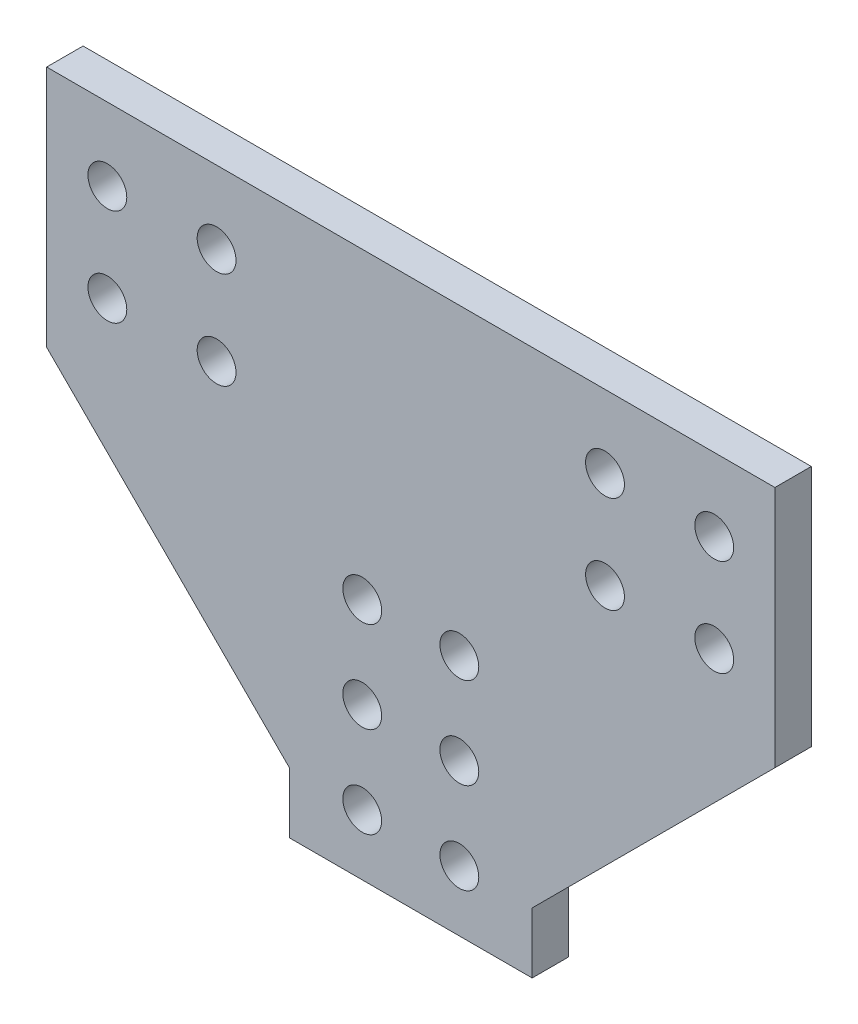
ISO-10303-21;
HEADER;
FILE_DESCRIPTION(('STEP AP214'),'2;1');
FILE_NAME('part.step','',(''),(''),'','','');
FILE_SCHEMA(('AUTOMOTIVE_DESIGN { 1 0 10303 214 1 1 1 1 }'));
ENDSEC;
DATA;
#1=APPLICATION_CONTEXT('core data for automotive mechanical design processes');
#2=APPLICATION_PROTOCOL_DEFINITION('international standard','automotive_design',2000,#1);
#3=PRODUCT_CONTEXT('',#1,'mechanical');
#4=PRODUCT('Part','Part','',(#3));
#5=PRODUCT_RELATED_PRODUCT_CATEGORY('part','',(#4));
#6=PRODUCT_DEFINITION_FORMATION('','',#4);
#7=PRODUCT_DEFINITION_CONTEXT('part definition',#1,'design');
#8=PRODUCT_DEFINITION('design','',#6,#7);
#9=PRODUCT_DEFINITION_SHAPE('','',#8);
#10=(LENGTH_UNIT() NAMED_UNIT(*) SI_UNIT(.MILLI.,.METRE.));
#11=(NAMED_UNIT(*) PLANE_ANGLE_UNIT() SI_UNIT($,.RADIAN.));
#12=(NAMED_UNIT(*) SI_UNIT($,.STERADIAN.) SOLID_ANGLE_UNIT());
#13=UNCERTAINTY_MEASURE_WITH_UNIT(LENGTH_MEASURE(1.E-05),#10,'distance_accuracy_value','');
#14=(GEOMETRIC_REPRESENTATION_CONTEXT(3) GLOBAL_UNCERTAINTY_ASSIGNED_CONTEXT((#13)) GLOBAL_UNIT_ASSIGNED_CONTEXT((#10,
#11,#12)) REPRESENTATION_CONTEXT('',''));
#15=CARTESIAN_POINT('',(0.,0.,0.));
#16=DIRECTION('',(0.,0.,1.));
#17=DIRECTION('',(1.,0.,0.));
#18=AXIS2_PLACEMENT_3D('',#15,#16,#17);
#19=CARTESIAN_POINT('',(0.,0.,3.));
#20=DIRECTION('',(0.707106781186544,0.707106781186551,0.));
#21=DIRECTION('',(-0.707106781186551,0.707106781186544,0.));
#22=AXIS2_PLACEMENT_3D('',#19,#20,#21);
#23=PLANE('',#22);
#24=DIRECTION('',(0.707106781186552,-0.707106781186544,0.));
#25=VECTOR('',#24,1.);
#26=CARTESIAN_POINT('',(0.,0.,0.));
#27=LINE('',#26,#25);
#28=CARTESIAN_POINT('',(0.,0.,0.));
#29=VERTEX_POINT('',#28);
#30=CARTESIAN_POINT('',(20.,-19.9999999999998,0.));
#31=VERTEX_POINT('',#30);
#32=EDGE_CURVE('E131',#29,#31,#27,.T.);
#33=ORIENTED_EDGE('',*,*,#32,.T.);
#34=DIRECTION('',(0.,0.,-1.));
#35=VECTOR('',#34,1.);
#36=CARTESIAN_POINT('',(20.,-19.9999999999998,3.));
#37=LINE('',#36,#35);
#38=CARTESIAN_POINT('',(20.,-19.9999999999998,3.));
#39=VERTEX_POINT('',#38);
#40=EDGE_CURVE('E11',#39,#31,#37,.T.);
#41=ORIENTED_EDGE('',*,*,#40,.F.);
#42=DIRECTION('',(0.707106781186552,-0.707106781186544,0.));
#43=VECTOR('',#42,1.);
#44=CARTESIAN_POINT('',(0.,0.,3.));
#45=LINE('',#44,#43);
#46=CARTESIAN_POINT('',(0.,0.,3.));
#47=VERTEX_POINT('',#46);
#48=EDGE_CURVE('E146',#47,#39,#45,.T.);
#49=ORIENTED_EDGE('',*,*,#48,.F.);
#50=DIRECTION('',(0.,0.,-1.));
#51=VECTOR('',#50,1.);
#52=CARTESIAN_POINT('',(0.,0.,3.));
#53=LINE('',#52,#51);
#54=EDGE_CURVE('E127',#47,#29,#53,.T.);
#55=ORIENTED_EDGE('',*,*,#54,.T.);
#56=EDGE_LOOP('',(#33,#41,#49,#55));
#57=FACE_BOUND('',#56,.T.);
#58=ADVANCED_FACE('F35',(#57),#23,.F.);
#59=CARTESIAN_POINT('',(20.,-19.9999999999998,3.));
#60=DIRECTION('',(1.,0.,0.));
#61=DIRECTION('',(0.,0.,-1.));
#62=AXIS2_PLACEMENT_3D('',#59,#60,#61);
#63=PLANE('',#62);
#64=DIRECTION('',(0.,-1.,0.));
#65=VECTOR('',#64,1.);
#66=CARTESIAN_POINT('',(20.,-19.9999999999998,0.));
#67=LINE('',#66,#65);
#68=CARTESIAN_POINT('',(20.,-25.,0.));
#69=VERTEX_POINT('',#68);
#70=EDGE_CURVE('E134',#31,#69,#67,.T.);
#71=ORIENTED_EDGE('',*,*,#70,.T.);
#72=DIRECTION('',(0.,0.,-1.));
#73=VECTOR('',#72,1.);
#74=CARTESIAN_POINT('',(20.,-25.,3.));
#75=LINE('',#74,#73);
#76=CARTESIAN_POINT('',(20.,-25.,3.));
#77=VERTEX_POINT('',#76);
#78=EDGE_CURVE('E43',#77,#69,#75,.T.);
#79=ORIENTED_EDGE('',*,*,#78,.F.);
#80=DIRECTION('',(0.,-1.,0.));
#81=VECTOR('',#80,1.);
#82=CARTESIAN_POINT('',(20.,-19.9999999999998,3.));
#83=LINE('',#82,#81);
#84=EDGE_CURVE('E94',#39,#77,#83,.T.);
#85=ORIENTED_EDGE('',*,*,#84,.F.);
#86=ORIENTED_EDGE('',*,*,#40,.T.);
#87=EDGE_LOOP('',(#71,#79,#85,#86));
#88=FACE_BOUND('',#87,.T.);
#89=ADVANCED_FACE('F305',(#88),#63,.F.);
#90=CARTESIAN_POINT('',(40.,-25.,3.));
#91=DIRECTION('',(0.,1.,0.));
#92=DIRECTION('',(0.,0.,1.));
#93=AXIS2_PLACEMENT_3D('',#90,#91,#92);
#94=PLANE('',#93);
#95=DIRECTION('',(1.,0.,0.));
#96=VECTOR('',#95,1.);
#97=CARTESIAN_POINT('',(40.,-25.,0.));
#98=LINE('',#97,#96);
#99=CARTESIAN_POINT('',(40.,-25.,0.));
#100=VERTEX_POINT('',#99);
#101=EDGE_CURVE('E137',#69,#100,#98,.T.);
#102=ORIENTED_EDGE('',*,*,#101,.T.);
#103=DIRECTION('',(0.,0.,-1.));
#104=VECTOR('',#103,1.);
#105=CARTESIAN_POINT('',(40.,-25.,3.));
#106=LINE('',#105,#104);
#107=CARTESIAN_POINT('',(40.,-25.,3.));
#108=VERTEX_POINT('',#107);
#109=EDGE_CURVE('E153',#108,#100,#106,.T.);
#110=ORIENTED_EDGE('',*,*,#109,.F.);
#111=DIRECTION('',(1.,0.,0.));
#112=VECTOR('',#111,1.);
#113=CARTESIAN_POINT('',(40.,-25.,3.));
#114=LINE('',#113,#112);
#115=EDGE_CURVE('E161',#77,#108,#114,.T.);
#116=ORIENTED_EDGE('',*,*,#115,.F.);
#117=ORIENTED_EDGE('',*,*,#78,.T.);
#118=EDGE_LOOP('',(#102,#110,#116,#117));
#119=FACE_BOUND('',#118,.T.);
#120=ADVANCED_FACE('F159',(#119),#94,.F.);
#121=CARTESIAN_POINT('',(40.,-20.0000000000001,3.));
#122=DIRECTION('',(-1.,0.,0.));
#123=DIRECTION('',(0.,0.,1.));
#124=AXIS2_PLACEMENT_3D('',#121,#122,#123);
#125=PLANE('',#124);
#126=DIRECTION('',(0.,1.,0.));
#127=VECTOR('',#126,1.);
#128=CARTESIAN_POINT('',(40.,-20.0000000000001,0.));
#129=LINE('',#128,#127);
#130=CARTESIAN_POINT('',(40.,-20.0000000000001,0.));
#131=VERTEX_POINT('',#130);
#132=EDGE_CURVE('E139',#100,#131,#129,.T.);
#133=ORIENTED_EDGE('',*,*,#132,.T.);
#134=DIRECTION('',(0.,0.,-1.));
#135=VECTOR('',#134,1.);
#136=CARTESIAN_POINT('',(40.,-20.0000000000001,3.));
#137=LINE('',#136,#135);
#138=CARTESIAN_POINT('',(40.,-20.0000000000001,3.));
#139=VERTEX_POINT('',#138);
#140=EDGE_CURVE('E150',#139,#131,#137,.T.);
#141=ORIENTED_EDGE('',*,*,#140,.F.);
#142=DIRECTION('',(0.,1.,0.));
#143=VECTOR('',#142,1.);
#144=CARTESIAN_POINT('',(40.,-20.0000000000001,3.));
#145=LINE('',#144,#143);
#146=EDGE_CURVE('E173',#108,#139,#145,.T.);
#147=ORIENTED_EDGE('',*,*,#146,.F.);
#148=ORIENTED_EDGE('',*,*,#109,.T.);
#149=EDGE_LOOP('',(#133,#141,#147,#148));
#150=FACE_BOUND('',#149,.T.);
#151=ADVANCED_FACE('F169',(#150),#125,.F.);
#152=CARTESIAN_POINT('',(60.,0.,3.));
#153=DIRECTION('',(-0.707106781186549,0.707106781186546,0.));
#154=DIRECTION('',(-0.707106781186546,-0.707106781186549,0.));
#155=AXIS2_PLACEMENT_3D('',#152,#153,#154);
#156=PLANE('',#155);
#157=DIRECTION('',(0.707106781186546,0.707106781186549,0.));
#158=VECTOR('',#157,1.);
#159=CARTESIAN_POINT('',(60.,0.,0.));
#160=LINE('',#159,#158);
#161=CARTESIAN_POINT('',(60.,0.,0.));
#162=VERTEX_POINT('',#161);
#163=EDGE_CURVE('E141',#131,#162,#160,.T.);
#164=ORIENTED_EDGE('',*,*,#163,.T.);
#165=DIRECTION('',(0.,0.,-1.));
#166=VECTOR('',#165,1.);
#167=CARTESIAN_POINT('',(60.,0.,3.));
#168=LINE('',#167,#166);
#169=CARTESIAN_POINT('',(60.,0.,3.));
#170=VERTEX_POINT('',#169);
#171=EDGE_CURVE('E122',#170,#162,#168,.T.);
#172=ORIENTED_EDGE('',*,*,#171,.F.);
#173=DIRECTION('',(0.707106781186546,0.707106781186549,0.));
#174=VECTOR('',#173,1.);
#175=CARTESIAN_POINT('',(60.,0.,3.));
#176=LINE('',#175,#174);
#177=EDGE_CURVE('E113',#139,#170,#176,.T.);
#178=ORIENTED_EDGE('',*,*,#177,.F.);
#179=ORIENTED_EDGE('',*,*,#140,.T.);
#180=EDGE_LOOP('',(#164,#172,#178,#179));
#181=FACE_BOUND('',#180,.T.);
#182=ADVANCED_FACE('F172',(#181),#156,.F.);
#183=CARTESIAN_POINT('',(60.,20.,3.));
#184=DIRECTION('',(-1.,0.,0.));
#185=DIRECTION('',(0.,0.,1.));
#186=AXIS2_PLACEMENT_3D('',#183,#184,#185);
#187=PLANE('',#186);
#188=DIRECTION('',(0.,1.,0.));
#189=VECTOR('',#188,1.);
#190=CARTESIAN_POINT('',(60.,20.,0.));
#191=LINE('',#190,#189);
#192=CARTESIAN_POINT('',(60.,20.,0.));
#193=VERTEX_POINT('',#192);
#194=EDGE_CURVE('E121',#162,#193,#191,.T.);
#195=ORIENTED_EDGE('',*,*,#194,.T.);
#196=DIRECTION('',(0.,0.,-1.));
#197=VECTOR('',#196,1.);
#198=CARTESIAN_POINT('',(60.,20.,3.));
#199=LINE('',#198,#197);
#200=CARTESIAN_POINT('',(60.,20.,3.));
#201=VERTEX_POINT('',#200);
#202=EDGE_CURVE('E118',#201,#193,#199,.T.);
#203=ORIENTED_EDGE('',*,*,#202,.F.);
#204=DIRECTION('',(0.,1.,0.));
#205=VECTOR('',#204,1.);
#206=CARTESIAN_POINT('',(60.,20.,3.));
#207=LINE('',#206,#205);
#208=EDGE_CURVE('E107',#170,#201,#207,.T.);
#209=ORIENTED_EDGE('',*,*,#208,.F.);
#210=ORIENTED_EDGE('',*,*,#171,.T.);
#211=EDGE_LOOP('',(#195,#203,#209,#210));
#212=FACE_BOUND('',#211,.T.);
#213=ADVANCED_FACE('F119',(#212),#187,.F.);
#214=CARTESIAN_POINT('',(0.,20.,3.));
#215=DIRECTION('',(0.,-1.,0.));
#216=DIRECTION('',(0.,0.,-1.));
#217=AXIS2_PLACEMENT_3D('',#214,#215,#216);
#218=PLANE('',#217);
#219=DIRECTION('',(-1.,0.,0.));
#220=VECTOR('',#219,1.);
#221=CARTESIAN_POINT('',(0.,20.,0.));
#222=LINE('',#221,#220);
#223=CARTESIAN_POINT('',(0.,20.,0.));
#224=VERTEX_POINT('',#223);
#225=EDGE_CURVE('E80',#193,#224,#222,.T.);
#226=ORIENTED_EDGE('',*,*,#225,.T.);
#227=DIRECTION('',(0.,0.,-1.));
#228=VECTOR('',#227,1.);
#229=CARTESIAN_POINT('',(0.,20.,3.));
#230=LINE('',#229,#228);
#231=CARTESIAN_POINT('',(0.,20.,3.));
#232=VERTEX_POINT('',#231);
#233=EDGE_CURVE('E123',#232,#224,#230,.T.);
#234=ORIENTED_EDGE('',*,*,#233,.F.);
#235=DIRECTION('',(-1.,0.,0.));
#236=VECTOR('',#235,1.);
#237=CARTESIAN_POINT('',(0.,20.,3.));
#238=LINE('',#237,#236);
#239=EDGE_CURVE('E111',#201,#232,#238,.T.);
#240=ORIENTED_EDGE('',*,*,#239,.F.);
#241=ORIENTED_EDGE('',*,*,#202,.T.);
#242=EDGE_LOOP('',(#226,#234,#240,#241));
#243=FACE_BOUND('',#242,.T.);
#244=ADVANCED_FACE('F125',(#243),#218,.F.);
#245=CARTESIAN_POINT('',(0.,0.,3.));
#246=DIRECTION('',(1.,0.,0.));
#247=DIRECTION('',(0.,0.,-1.));
#248=AXIS2_PLACEMENT_3D('',#245,#246,#247);
#249=PLANE('',#248);
#250=DIRECTION('',(0.,-1.,0.));
#251=VECTOR('',#250,1.);
#252=CARTESIAN_POINT('',(0.,0.,0.));
#253=LINE('',#252,#251);
#254=EDGE_CURVE('E86',#224,#29,#253,.T.);
#255=ORIENTED_EDGE('',*,*,#254,.T.);
#256=ORIENTED_EDGE('',*,*,#54,.F.);
#257=DIRECTION('',(0.,-1.,0.));
#258=VECTOR('',#257,1.);
#259=CARTESIAN_POINT('',(0.,0.,3.));
#260=LINE('',#259,#258);
#261=EDGE_CURVE('E51',#232,#47,#260,.T.);
#262=ORIENTED_EDGE('',*,*,#261,.F.);
#263=ORIENTED_EDGE('',*,*,#233,.T.);
#264=EDGE_LOOP('',(#255,#256,#262,#263));
#265=FACE_BOUND('',#264,.T.);
#266=ADVANCED_FACE('F275',(#265),#249,.F.);
#267=CARTESIAN_POINT('',(0.,0.,3.));
#268=DIRECTION('',(0.,0.,-1.));
#269=DIRECTION('',(-1.,0.,0.));
#270=AXIS2_PLACEMENT_3D('',#267,#268,#269);
#271=PLANE('',#270);
#272=CARTESIAN_POINT('',(34.,-12.5,3.));
#273=DIRECTION('',(0.,0.,1.));
#274=DIRECTION('',(1.,0.,0.));
#275=AXIS2_PLACEMENT_3D('',#272,#273,#274);
#276=CIRCLE('',#275,1.6);
#277=CARTESIAN_POINT('',(35.6,-12.5,3.));
#278=VERTEX_POINT('',#277);
#279=EDGE_CURVE('E216',#278,#278,#276,.T.);
#280=ORIENTED_EDGE('',*,*,#279,.F.);
#281=EDGE_LOOP('',(#280));
#282=FACE_BOUND('',#281,.T.);
#283=CARTESIAN_POINT('',(5.,14.,3.));
#284=DIRECTION('',(0.,0.,1.));
#285=DIRECTION('',(1.,0.,0.));
#286=AXIS2_PLACEMENT_3D('',#283,#284,#285);
#287=CIRCLE('',#286,1.6);
#288=CARTESIAN_POINT('',(6.6,14.,3.));
#289=VERTEX_POINT('',#288);
#290=EDGE_CURVE('E209',#289,#289,#287,.T.);
#291=ORIENTED_EDGE('',*,*,#290,.F.);
#292=EDGE_LOOP('',(#291));
#293=FACE_BOUND('',#292,.T.);
#294=CARTESIAN_POINT('',(5.,6.,3.));
#295=DIRECTION('',(0.,0.,1.));
#296=DIRECTION('',(1.,0.,0.));
#297=AXIS2_PLACEMENT_3D('',#294,#295,#296);
#298=CIRCLE('',#297,1.6);
#299=CARTESIAN_POINT('',(6.6,6.,3.));
#300=VERTEX_POINT('',#299);
#301=EDGE_CURVE('E228',#300,#300,#298,.T.);
#302=ORIENTED_EDGE('',*,*,#301,.F.);
#303=EDGE_LOOP('',(#302));
#304=FACE_BOUND('',#303,.T.);
#305=CARTESIAN_POINT('',(14.,14.,3.));
#306=DIRECTION('',(0.,0.,1.));
#307=DIRECTION('',(1.,0.,0.));
#308=AXIS2_PLACEMENT_3D('',#305,#306,#307);
#309=CIRCLE('',#308,1.6);
#310=CARTESIAN_POINT('',(15.6,14.,3.));
#311=VERTEX_POINT('',#310);
#312=EDGE_CURVE('E221',#311,#311,#309,.T.);
#313=ORIENTED_EDGE('',*,*,#312,.F.);
#314=EDGE_LOOP('',(#313));
#315=FACE_BOUND('',#314,.T.);
#316=CARTESIAN_POINT('',(34.,-5.,3.));
#317=DIRECTION('',(0.,0.,1.));
#318=DIRECTION('',(1.,0.,0.));
#319=AXIS2_PLACEMENT_3D('',#316,#317,#318);
#320=CIRCLE('',#319,1.6);
#321=CARTESIAN_POINT('',(35.6,-5.,3.));
#322=VERTEX_POINT('',#321);
#323=EDGE_CURVE('E192',#322,#322,#320,.T.);
#324=ORIENTED_EDGE('',*,*,#323,.F.);
#325=EDGE_LOOP('',(#324));
#326=FACE_BOUND('',#325,.T.);
#327=CARTESIAN_POINT('',(26.,-20.,3.));
#328=DIRECTION('',(0.,0.,1.));
#329=DIRECTION('',(1.,0.,0.));
#330=AXIS2_PLACEMENT_3D('',#327,#328,#329);
#331=CIRCLE('',#330,1.6);
#332=CARTESIAN_POINT('',(27.6,-20.,3.));
#333=VERTEX_POINT('',#332);
#334=EDGE_CURVE('E185',#333,#333,#331,.T.);
#335=ORIENTED_EDGE('',*,*,#334,.F.);
#336=EDGE_LOOP('',(#335));
#337=FACE_BOUND('',#336,.T.);
#338=CARTESIAN_POINT('',(34.,-20.,3.));
#339=DIRECTION('',(0.,0.,1.));
#340=DIRECTION('',(1.,0.,0.));
#341=AXIS2_PLACEMENT_3D('',#338,#339,#340);
#342=CIRCLE('',#341,1.6);
#343=CARTESIAN_POINT('',(35.6,-20.,3.));
#344=VERTEX_POINT('',#343);
#345=EDGE_CURVE('E204',#344,#344,#342,.T.);
#346=ORIENTED_EDGE('',*,*,#345,.F.);
#347=EDGE_LOOP('',(#346));
#348=FACE_BOUND('',#347,.T.);
#349=CARTESIAN_POINT('',(26.,-12.5,3.));
#350=DIRECTION('',(0.,0.,1.));
#351=DIRECTION('',(1.,0.,0.));
#352=AXIS2_PLACEMENT_3D('',#349,#350,#351);
#353=CIRCLE('',#352,1.6);
#354=CARTESIAN_POINT('',(27.6,-12.5,3.));
#355=VERTEX_POINT('',#354);
#356=EDGE_CURVE('E197',#355,#355,#353,.T.);
#357=ORIENTED_EDGE('',*,*,#356,.F.);
#358=EDGE_LOOP('',(#357));
#359=FACE_BOUND('',#358,.T.);
#360=CARTESIAN_POINT('',(46.,6.,3.));
#361=DIRECTION('',(0.,0.,1.));
#362=DIRECTION('',(1.,0.,0.));
#363=AXIS2_PLACEMENT_3D('',#360,#361,#362);
#364=CIRCLE('',#363,1.6);
#365=CARTESIAN_POINT('',(47.6,6.,3.));
#366=VERTEX_POINT('',#365);
#367=EDGE_CURVE('E257',#366,#366,#364,.T.);
#368=ORIENTED_EDGE('',*,*,#367,.F.);
#369=EDGE_LOOP('',(#368));
#370=FACE_BOUND('',#369,.T.);
#371=CARTESIAN_POINT('',(14.,6.,3.));
#372=DIRECTION('',(0.,0.,1.));
#373=DIRECTION('',(1.,0.,0.));
#374=AXIS2_PLACEMENT_3D('',#371,#372,#373);
#375=CIRCLE('',#374,1.6);
#376=CARTESIAN_POINT('',(15.6,6.,3.));
#377=VERTEX_POINT('',#376);
#378=EDGE_CURVE('E240',#377,#377,#375,.T.);
#379=ORIENTED_EDGE('',*,*,#378,.F.);
#380=EDGE_LOOP('',(#379));
#381=FACE_BOUND('',#380,.T.);
#382=CARTESIAN_POINT('',(55.,14.,3.));
#383=DIRECTION('',(0.,0.,1.));
#384=DIRECTION('',(1.,0.,0.));
#385=AXIS2_PLACEMENT_3D('',#382,#383,#384);
#386=CIRCLE('',#385,1.6);
#387=CARTESIAN_POINT('',(56.6,14.,3.));
#388=VERTEX_POINT('',#387);
#389=EDGE_CURVE('E233',#388,#388,#386,.T.);
#390=ORIENTED_EDGE('',*,*,#389,.F.);
#391=EDGE_LOOP('',(#390));
#392=FACE_BOUND('',#391,.T.);
#393=CARTESIAN_POINT('',(55.,6.,3.));
#394=DIRECTION('',(0.,0.,1.));
#395=DIRECTION('',(1.,0.,0.));
#396=AXIS2_PLACEMENT_3D('',#393,#394,#395);
#397=CIRCLE('',#396,1.6);
#398=CARTESIAN_POINT('',(56.6,6.,3.));
#399=VERTEX_POINT('',#398);
#400=EDGE_CURVE('E252',#399,#399,#397,.T.);
#401=ORIENTED_EDGE('',*,*,#400,.F.);
#402=EDGE_LOOP('',(#401));
#403=FACE_BOUND('',#402,.T.);
#404=CARTESIAN_POINT('',(46.,14.,3.));
#405=DIRECTION('',(0.,0.,1.));
#406=DIRECTION('',(1.,0.,0.));
#407=AXIS2_PLACEMENT_3D('',#404,#405,#406);
#408=CIRCLE('',#407,1.6);
#409=CARTESIAN_POINT('',(47.6,14.,3.));
#410=VERTEX_POINT('',#409);
#411=EDGE_CURVE('E245',#410,#410,#408,.T.);
#412=ORIENTED_EDGE('',*,*,#411,.F.);
#413=EDGE_LOOP('',(#412));
#414=FACE_BOUND('',#413,.T.);
#415=CARTESIAN_POINT('',(26.,-5.,3.));
#416=DIRECTION('',(0.,0.,1.));
#417=DIRECTION('',(1.,0.,0.));
#418=AXIS2_PLACEMENT_3D('',#415,#416,#417);
#419=CIRCLE('',#418,1.6);
#420=CARTESIAN_POINT('',(27.6,-5.,3.));
#421=VERTEX_POINT('',#420);
#422=EDGE_CURVE('E179',#421,#421,#419,.T.);
#423=ORIENTED_EDGE('',*,*,#422,.F.);
#424=EDGE_LOOP('',(#423));
#425=FACE_BOUND('',#424,.T.);
#426=ORIENTED_EDGE('',*,*,#48,.T.);
#427=ORIENTED_EDGE('',*,*,#84,.T.);
#428=ORIENTED_EDGE('',*,*,#115,.T.);
#429=ORIENTED_EDGE('',*,*,#146,.T.);
#430=ORIENTED_EDGE('',*,*,#177,.T.);
#431=ORIENTED_EDGE('',*,*,#208,.T.);
#432=ORIENTED_EDGE('',*,*,#239,.T.);
#433=ORIENTED_EDGE('',*,*,#261,.T.);
#434=EDGE_LOOP('',(#426,#427,#428,#429,#430,#431,#432,#433));
#435=FACE_BOUND('',#434,.T.);
#436=ADVANCED_FACE('F109',(#282,#293,#304,#315,#326,#337,#348,#359,#370,#381,#392,#403,#414,
#425,#435),#271,.F.);
#437=CARTESIAN_POINT('',(0.,0.,0.));
#438=DIRECTION('',(0.,0.,-1.));
#439=DIRECTION('',(-1.,0.,0.));
#440=AXIS2_PLACEMENT_3D('',#437,#438,#439);
#441=PLANE('',#440);
#442=CARTESIAN_POINT('',(34.,-12.5,0.));
#443=DIRECTION('',(0.,0.,1.));
#444=DIRECTION('',(1.,0.,0.));
#445=AXIS2_PLACEMENT_3D('',#442,#443,#444);
#446=CIRCLE('',#445,1.6);
#447=CARTESIAN_POINT('',(35.6,-12.5,0.));
#448=VERTEX_POINT('',#447);
#449=EDGE_CURVE('E201',#448,#448,#446,.T.);
#450=ORIENTED_EDGE('',*,*,#449,.T.);
#451=EDGE_LOOP('',(#450));
#452=FACE_BOUND('',#451,.T.);
#453=CARTESIAN_POINT('',(5.,14.,0.));
#454=DIRECTION('',(0.,0.,1.));
#455=DIRECTION('',(1.,0.,0.));
#456=AXIS2_PLACEMENT_3D('',#453,#454,#455);
#457=CIRCLE('',#456,1.6);
#458=CARTESIAN_POINT('',(6.6,14.,0.));
#459=VERTEX_POINT('',#458);
#460=EDGE_CURVE('E212',#459,#459,#457,.T.);
#461=ORIENTED_EDGE('',*,*,#460,.T.);
#462=EDGE_LOOP('',(#461));
#463=FACE_BOUND('',#462,.T.);
#464=CARTESIAN_POINT('',(5.,6.,0.));
#465=DIRECTION('',(0.,0.,1.));
#466=DIRECTION('',(1.,0.,0.));
#467=AXIS2_PLACEMENT_3D('',#464,#465,#466);
#468=CIRCLE('',#467,1.6);
#469=CARTESIAN_POINT('',(6.6,6.,0.));
#470=VERTEX_POINT('',#469);
#471=EDGE_CURVE('E213',#470,#470,#468,.T.);
#472=ORIENTED_EDGE('',*,*,#471,.T.);
#473=EDGE_LOOP('',(#472));
#474=FACE_BOUND('',#473,.T.);
#475=CARTESIAN_POINT('',(14.,14.,0.));
#476=DIRECTION('',(0.,0.,1.));
#477=DIRECTION('',(1.,0.,0.));
#478=AXIS2_PLACEMENT_3D('',#475,#476,#477);
#479=CIRCLE('',#478,1.6);
#480=CARTESIAN_POINT('',(15.6,14.,0.));
#481=VERTEX_POINT('',#480);
#482=EDGE_CURVE('E224',#481,#481,#479,.T.);
#483=ORIENTED_EDGE('',*,*,#482,.T.);
#484=EDGE_LOOP('',(#483));
#485=FACE_BOUND('',#484,.T.);
#486=CARTESIAN_POINT('',(34.,-5.,0.));
#487=DIRECTION('',(0.,0.,1.));
#488=DIRECTION('',(1.,0.,0.));
#489=AXIS2_PLACEMENT_3D('',#486,#487,#488);
#490=CIRCLE('',#489,1.6);
#491=CARTESIAN_POINT('',(35.6,-5.,0.));
#492=VERTEX_POINT('',#491);
#493=EDGE_CURVE('E182',#492,#492,#490,.T.);
#494=ORIENTED_EDGE('',*,*,#493,.T.);
#495=EDGE_LOOP('',(#494));
#496=FACE_BOUND('',#495,.T.);
#497=CARTESIAN_POINT('',(26.,-20.,0.));
#498=DIRECTION('',(0.,0.,1.));
#499=DIRECTION('',(1.,0.,0.));
#500=AXIS2_PLACEMENT_3D('',#497,#498,#499);
#501=CIRCLE('',#500,1.6);
#502=CARTESIAN_POINT('',(27.6,-20.,0.));
#503=VERTEX_POINT('',#502);
#504=EDGE_CURVE('E188',#503,#503,#501,.T.);
#505=ORIENTED_EDGE('',*,*,#504,.T.);
#506=EDGE_LOOP('',(#505));
#507=FACE_BOUND('',#506,.T.);
#508=CARTESIAN_POINT('',(34.,-20.,0.));
#509=DIRECTION('',(0.,0.,1.));
#510=DIRECTION('',(1.,0.,0.));
#511=AXIS2_PLACEMENT_3D('',#508,#509,#510);
#512=CIRCLE('',#511,1.6);
#513=CARTESIAN_POINT('',(35.6,-20.,0.));
#514=VERTEX_POINT('',#513);
#515=EDGE_CURVE('E189',#514,#514,#512,.T.);
#516=ORIENTED_EDGE('',*,*,#515,.T.);
#517=EDGE_LOOP('',(#516));
#518=FACE_BOUND('',#517,.T.);
#519=CARTESIAN_POINT('',(26.,-12.5,0.));
#520=DIRECTION('',(0.,0.,1.));
#521=DIRECTION('',(1.,0.,0.));
#522=AXIS2_PLACEMENT_3D('',#519,#520,#521);
#523=CIRCLE('',#522,1.6);
#524=CARTESIAN_POINT('',(27.6,-12.5,0.));
#525=VERTEX_POINT('',#524);
#526=EDGE_CURVE('E200',#525,#525,#523,.T.);
#527=ORIENTED_EDGE('',*,*,#526,.T.);
#528=EDGE_LOOP('',(#527));
#529=FACE_BOUND('',#528,.T.);
#530=CARTESIAN_POINT('',(46.,6.,0.));
#531=DIRECTION('',(0.,0.,1.));
#532=DIRECTION('',(1.,0.,0.));
#533=AXIS2_PLACEMENT_3D('',#530,#531,#532);
#534=CIRCLE('',#533,1.6);
#535=CARTESIAN_POINT('',(47.6,6.,0.));
#536=VERTEX_POINT('',#535);
#537=EDGE_CURVE('E249',#536,#536,#534,.T.);
#538=ORIENTED_EDGE('',*,*,#537,.T.);
#539=EDGE_LOOP('',(#538));
#540=FACE_BOUND('',#539,.T.);
#541=CARTESIAN_POINT('',(14.,6.,0.));
#542=DIRECTION('',(0.,0.,1.));
#543=DIRECTION('',(1.,0.,0.));
#544=AXIS2_PLACEMENT_3D('',#541,#542,#543);
#545=CIRCLE('',#544,1.6);
#546=CARTESIAN_POINT('',(15.6,6.,0.));
#547=VERTEX_POINT('',#546);
#548=EDGE_CURVE('E225',#547,#547,#545,.T.);
#549=ORIENTED_EDGE('',*,*,#548,.T.);
#550=EDGE_LOOP('',(#549));
#551=FACE_BOUND('',#550,.T.);
#552=CARTESIAN_POINT('',(55.,14.,0.));
#553=DIRECTION('',(0.,0.,1.));
#554=DIRECTION('',(1.,0.,0.));
#555=AXIS2_PLACEMENT_3D('',#552,#553,#554);
#556=CIRCLE('',#555,1.6);
#557=CARTESIAN_POINT('',(56.6,14.,0.));
#558=VERTEX_POINT('',#557);
#559=EDGE_CURVE('E236',#558,#558,#556,.T.);
#560=ORIENTED_EDGE('',*,*,#559,.T.);
#561=EDGE_LOOP('',(#560));
#562=FACE_BOUND('',#561,.T.);
#563=CARTESIAN_POINT('',(55.,6.,0.));
#564=DIRECTION('',(0.,0.,1.));
#565=DIRECTION('',(1.,0.,0.));
#566=AXIS2_PLACEMENT_3D('',#563,#564,#565);
#567=CIRCLE('',#566,1.6);
#568=CARTESIAN_POINT('',(56.6,6.,0.));
#569=VERTEX_POINT('',#568);
#570=EDGE_CURVE('E237',#569,#569,#567,.T.);
#571=ORIENTED_EDGE('',*,*,#570,.T.);
#572=EDGE_LOOP('',(#571));
#573=FACE_BOUND('',#572,.T.);
#574=CARTESIAN_POINT('',(46.,14.,0.));
#575=DIRECTION('',(0.,0.,1.));
#576=DIRECTION('',(1.,0.,0.));
#577=AXIS2_PLACEMENT_3D('',#574,#575,#576);
#578=CIRCLE('',#577,1.6);
#579=CARTESIAN_POINT('',(47.6,14.,0.));
#580=VERTEX_POINT('',#579);
#581=EDGE_CURVE('E248',#580,#580,#578,.T.);
#582=ORIENTED_EDGE('',*,*,#581,.T.);
#583=EDGE_LOOP('',(#582));
#584=FACE_BOUND('',#583,.T.);
#585=CARTESIAN_POINT('',(26.,-5.,0.));
#586=DIRECTION('',(0.,0.,1.));
#587=DIRECTION('',(1.,0.,0.));
#588=AXIS2_PLACEMENT_3D('',#585,#586,#587);
#589=CIRCLE('',#588,1.6);
#590=CARTESIAN_POINT('',(27.6,-5.,0.));
#591=VERTEX_POINT('',#590);
#592=EDGE_CURVE('E135',#591,#591,#589,.T.);
#593=ORIENTED_EDGE('',*,*,#592,.T.);
#594=EDGE_LOOP('',(#593));
#595=FACE_BOUND('',#594,.T.);
#596=ORIENTED_EDGE('',*,*,#32,.F.);
#597=ORIENTED_EDGE('',*,*,#254,.F.);
#598=ORIENTED_EDGE('',*,*,#225,.F.);
#599=ORIENTED_EDGE('',*,*,#194,.F.);
#600=ORIENTED_EDGE('',*,*,#163,.F.);
#601=ORIENTED_EDGE('',*,*,#132,.F.);
#602=ORIENTED_EDGE('',*,*,#101,.F.);
#603=ORIENTED_EDGE('',*,*,#70,.F.);
#604=EDGE_LOOP('',(#596,#597,#598,#599,#600,#601,#602,#603));
#605=FACE_BOUND('',#604,.T.);
#606=ADVANCED_FACE('F165',(#452,#463,#474,#485,#496,#507,#518,#529,#540,#551,#562,#573,#584,
#595,#605),#441,.T.);
#607=CARTESIAN_POINT('',(26.,-5.,0.));
#608=DIRECTION('',(0.,0.,1.));
#609=DIRECTION('',(1.,0.,0.));
#610=AXIS2_PLACEMENT_3D('',#607,#608,#609);
#611=CYLINDRICAL_SURFACE('',#610,1.6);
#612=ORIENTED_EDGE('',*,*,#592,.F.);
#613=EDGE_LOOP('',(#612));
#614=FACE_BOUND('',#613,.T.);
#615=ORIENTED_EDGE('',*,*,#422,.T.);
#616=EDGE_LOOP('',(#615));
#617=FACE_BOUND('',#616,.T.);
#618=ADVANCED_FACE('F288',(#614,#617),#611,.F.);
#619=CARTESIAN_POINT('',(46.,14.,0.));
#620=DIRECTION('',(0.,0.,1.));
#621=DIRECTION('',(1.,0.,0.));
#622=AXIS2_PLACEMENT_3D('',#619,#620,#621);
#623=CYLINDRICAL_SURFACE('',#622,1.6);
#624=ORIENTED_EDGE('',*,*,#581,.F.);
#625=EDGE_LOOP('',(#624));
#626=FACE_BOUND('',#625,.T.);
#627=ORIENTED_EDGE('',*,*,#411,.T.);
#628=EDGE_LOOP('',(#627));
#629=FACE_BOUND('',#628,.T.);
#630=ADVANCED_FACE('F290',(#626,#629),#623,.F.);
#631=CARTESIAN_POINT('',(55.,6.,0.));
#632=DIRECTION('',(0.,0.,1.));
#633=DIRECTION('',(1.,0.,0.));
#634=AXIS2_PLACEMENT_3D('',#631,#632,#633);
#635=CYLINDRICAL_SURFACE('',#634,1.6);
#636=ORIENTED_EDGE('',*,*,#570,.F.);
#637=EDGE_LOOP('',(#636));
#638=FACE_BOUND('',#637,.T.);
#639=ORIENTED_EDGE('',*,*,#400,.T.);
#640=EDGE_LOOP('',(#639));
#641=FACE_BOUND('',#640,.T.);
#642=ADVANCED_FACE('F297',(#638,#641),#635,.F.);
#643=CARTESIAN_POINT('',(55.,14.,0.));
#644=DIRECTION('',(0.,0.,1.));
#645=DIRECTION('',(1.,0.,0.));
#646=AXIS2_PLACEMENT_3D('',#643,#644,#645);
#647=CYLINDRICAL_SURFACE('',#646,1.6);
#648=ORIENTED_EDGE('',*,*,#559,.F.);
#649=EDGE_LOOP('',(#648));
#650=FACE_BOUND('',#649,.T.);
#651=ORIENTED_EDGE('',*,*,#389,.T.);
#652=EDGE_LOOP('',(#651));
#653=FACE_BOUND('',#652,.T.);
#654=ADVANCED_FACE('F381',(#650,#653),#647,.F.);
#655=CARTESIAN_POINT('',(14.,6.,0.));
#656=DIRECTION('',(0.,0.,1.));
#657=DIRECTION('',(1.,0.,0.));
#658=AXIS2_PLACEMENT_3D('',#655,#656,#657);
#659=CYLINDRICAL_SURFACE('',#658,1.6);
#660=ORIENTED_EDGE('',*,*,#548,.F.);
#661=EDGE_LOOP('',(#660));
#662=FACE_BOUND('',#661,.T.);
#663=ORIENTED_EDGE('',*,*,#378,.T.);
#664=EDGE_LOOP('',(#663));
#665=FACE_BOUND('',#664,.T.);
#666=ADVANCED_FACE('F269',(#662,#665),#659,.F.);
#667=CARTESIAN_POINT('',(46.,6.,0.));
#668=DIRECTION('',(0.,0.,1.));
#669=DIRECTION('',(1.,0.,0.));
#670=AXIS2_PLACEMENT_3D('',#667,#668,#669);
#671=CYLINDRICAL_SURFACE('',#670,1.6);
#672=ORIENTED_EDGE('',*,*,#537,.F.);
#673=EDGE_LOOP('',(#672));
#674=FACE_BOUND('',#673,.T.);
#675=ORIENTED_EDGE('',*,*,#367,.T.);
#676=EDGE_LOOP('',(#675));
#677=FACE_BOUND('',#676,.T.);
#678=ADVANCED_FACE('F265',(#674,#677),#671,.F.);
#679=CARTESIAN_POINT('',(26.,-12.5,0.));
#680=DIRECTION('',(0.,0.,1.));
#681=DIRECTION('',(1.,0.,0.));
#682=AXIS2_PLACEMENT_3D('',#679,#680,#681);
#683=CYLINDRICAL_SURFACE('',#682,1.6);
#684=ORIENTED_EDGE('',*,*,#526,.F.);
#685=EDGE_LOOP('',(#684));
#686=FACE_BOUND('',#685,.T.);
#687=ORIENTED_EDGE('',*,*,#356,.T.);
#688=EDGE_LOOP('',(#687));
#689=FACE_BOUND('',#688,.T.);
#690=ADVANCED_FACE('F268',(#686,#689),#683,.F.);
#691=CARTESIAN_POINT('',(34.,-20.,0.));
#692=DIRECTION('',(0.,0.,1.));
#693=DIRECTION('',(1.,0.,0.));
#694=AXIS2_PLACEMENT_3D('',#691,#692,#693);
#695=CYLINDRICAL_SURFACE('',#694,1.6);
#696=ORIENTED_EDGE('',*,*,#515,.F.);
#697=EDGE_LOOP('',(#696));
#698=FACE_BOUND('',#697,.T.);
#699=ORIENTED_EDGE('',*,*,#345,.T.);
#700=EDGE_LOOP('',(#699));
#701=FACE_BOUND('',#700,.T.);
#702=ADVANCED_FACE('F415',(#698,#701),#695,.F.);
#703=CARTESIAN_POINT('',(26.,-20.,0.));
#704=DIRECTION('',(0.,0.,1.));
#705=DIRECTION('',(1.,0.,0.));
#706=AXIS2_PLACEMENT_3D('',#703,#704,#705);
#707=CYLINDRICAL_SURFACE('',#706,1.6);
#708=ORIENTED_EDGE('',*,*,#504,.F.);
#709=EDGE_LOOP('',(#708));
#710=FACE_BOUND('',#709,.T.);
#711=ORIENTED_EDGE('',*,*,#334,.T.);
#712=EDGE_LOOP('',(#711));
#713=FACE_BOUND('',#712,.T.);
#714=ADVANCED_FACE('F425',(#710,#713),#707,.F.);
#715=CARTESIAN_POINT('',(34.,-5.,0.));
#716=DIRECTION('',(0.,0.,1.));
#717=DIRECTION('',(1.,0.,0.));
#718=AXIS2_PLACEMENT_3D('',#715,#716,#717);
#719=CYLINDRICAL_SURFACE('',#718,1.6);
#720=ORIENTED_EDGE('',*,*,#493,.F.);
#721=EDGE_LOOP('',(#720));
#722=FACE_BOUND('',#721,.T.);
#723=ORIENTED_EDGE('',*,*,#323,.T.);
#724=EDGE_LOOP('',(#723));
#725=FACE_BOUND('',#724,.T.);
#726=ADVANCED_FACE('F435',(#722,#725),#719,.F.);
#727=CARTESIAN_POINT('',(14.,14.,0.));
#728=DIRECTION('',(0.,0.,1.));
#729=DIRECTION('',(1.,0.,0.));
#730=AXIS2_PLACEMENT_3D('',#727,#728,#729);
#731=CYLINDRICAL_SURFACE('',#730,1.6);
#732=ORIENTED_EDGE('',*,*,#482,.F.);
#733=EDGE_LOOP('',(#732));
#734=FACE_BOUND('',#733,.T.);
#735=ORIENTED_EDGE('',*,*,#312,.T.);
#736=EDGE_LOOP('',(#735));
#737=FACE_BOUND('',#736,.T.);
#738=ADVANCED_FACE('F444',(#734,#737),#731,.F.);
#739=CARTESIAN_POINT('',(5.,6.,0.));
#740=DIRECTION('',(0.,0.,1.));
#741=DIRECTION('',(1.,0.,0.));
#742=AXIS2_PLACEMENT_3D('',#739,#740,#741);
#743=CYLINDRICAL_SURFACE('',#742,1.6);
#744=ORIENTED_EDGE('',*,*,#471,.F.);
#745=EDGE_LOOP('',(#744));
#746=FACE_BOUND('',#745,.T.);
#747=ORIENTED_EDGE('',*,*,#301,.T.);
#748=EDGE_LOOP('',(#747));
#749=FACE_BOUND('',#748,.T.);
#750=ADVANCED_FACE('F454',(#746,#749),#743,.F.);
#751=CARTESIAN_POINT('',(5.,14.,0.));
#752=DIRECTION('',(0.,0.,1.));
#753=DIRECTION('',(1.,0.,0.));
#754=AXIS2_PLACEMENT_3D('',#751,#752,#753);
#755=CYLINDRICAL_SURFACE('',#754,1.6);
#756=ORIENTED_EDGE('',*,*,#460,.F.);
#757=EDGE_LOOP('',(#756));
#758=FACE_BOUND('',#757,.T.);
#759=ORIENTED_EDGE('',*,*,#290,.T.);
#760=EDGE_LOOP('',(#759));
#761=FACE_BOUND('',#760,.T.);
#762=ADVANCED_FACE('F464',(#758,#761),#755,.F.);
#763=CARTESIAN_POINT('',(34.,-12.5,0.));
#764=DIRECTION('',(0.,0.,1.));
#765=DIRECTION('',(1.,0.,0.));
#766=AXIS2_PLACEMENT_3D('',#763,#764,#765);
#767=CYLINDRICAL_SURFACE('',#766,1.6);
#768=ORIENTED_EDGE('',*,*,#449,.F.);
#769=EDGE_LOOP('',(#768));
#770=FACE_BOUND('',#769,.T.);
#771=ORIENTED_EDGE('',*,*,#279,.T.);
#772=EDGE_LOOP('',(#771));
#773=FACE_BOUND('',#772,.T.);
#774=ADVANCED_FACE('F474',(#770,#773),#767,.F.);
#775=CLOSED_SHELL('',(#58,#89,#120,#151,#182,#213,#244,#266,#436,#606,#618,#630,#642,#654,#666,
#678,#690,#702,#714,#726,#738,#750,#762,#774));
#776=MANIFOLD_SOLID_BREP('B2',#775);
#777=ADVANCED_BREP_SHAPE_REPRESENTATION('',(#18,#776),#14);
#778=SHAPE_DEFINITION_REPRESENTATION(#9,#777);
ENDSEC;
END-ISO-10303-21;
